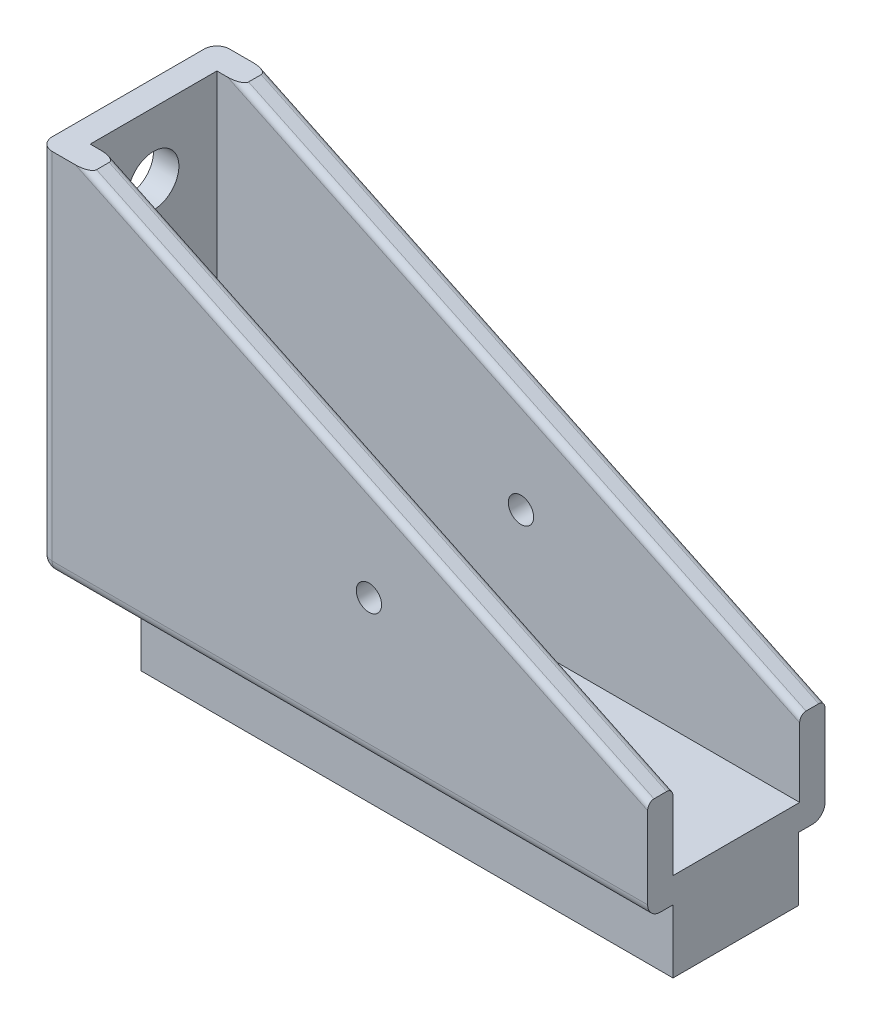
ISO-10303-21;
HEADER;
FILE_DESCRIPTION(('STEP AP214'),'2;1');
FILE_NAME('part.step','',(''),(''),'','','');
FILE_SCHEMA(('AUTOMOTIVE_DESIGN { 1 0 10303 214 1 1 1 1 }'));
ENDSEC;
DATA;
#1=APPLICATION_CONTEXT('core data for automotive mechanical design processes');
#2=APPLICATION_PROTOCOL_DEFINITION('international standard','automotive_design',2000,#1);
#3=PRODUCT_CONTEXT('',#1,'mechanical');
#4=PRODUCT('Part','Part','',(#3));
#5=PRODUCT_RELATED_PRODUCT_CATEGORY('part','',(#4));
#6=PRODUCT_DEFINITION_FORMATION('','',#4);
#7=PRODUCT_DEFINITION_CONTEXT('part definition',#1,'design');
#8=PRODUCT_DEFINITION('design','',#6,#7);
#9=PRODUCT_DEFINITION_SHAPE('','',#8);
#10=(LENGTH_UNIT() NAMED_UNIT(*) SI_UNIT(.MILLI.,.METRE.));
#11=(NAMED_UNIT(*) PLANE_ANGLE_UNIT() SI_UNIT($,.RADIAN.));
#12=(NAMED_UNIT(*) SI_UNIT($,.STERADIAN.) SOLID_ANGLE_UNIT());
#13=UNCERTAINTY_MEASURE_WITH_UNIT(LENGTH_MEASURE(1.E-05),#10,'distance_accuracy_value','');
#14=(GEOMETRIC_REPRESENTATION_CONTEXT(3) GLOBAL_UNCERTAINTY_ASSIGNED_CONTEXT((#13)) GLOBAL_UNIT_ASSIGNED_CONTEXT((#10,
#11,#12)) REPRESENTATION_CONTEXT('',''));
#15=CARTESIAN_POINT('',(0.,0.,0.));
#16=DIRECTION('',(0.,0.,1.));
#17=DIRECTION('',(1.,0.,0.));
#18=AXIS2_PLACEMENT_3D('',#15,#16,#17);
#19=CARTESIAN_POINT('',(-45.3827683615819,3.08601694915253,-14.));
#20=DIRECTION('',(0.,-1.,0.));
#21=DIRECTION('',(0.,0.,-1.));
#22=AXIS2_PLACEMENT_3D('',#19,#20,#21);
#23=PLANE('',#22);
#24=DIRECTION('',(1.,0.,0.));
#25=VECTOR('',#24,1.);
#26=CARTESIAN_POINT('',(-45.3827683615819,3.08601694915253,-1.));
#27=LINE('',#26,#25);
#28=CARTESIAN_POINT('',(2.61723163841807,3.08601694915253,-0.999999999999999));
#29=VERTEX_POINT('',#28);
#30=CARTESIAN_POINT('',(-44.3827683615819,3.08601694915253,-1.));
#31=VERTEX_POINT('',#30);
#32=EDGE_CURVE('E297',#29,#31,#27,.F.);
#33=ORIENTED_EDGE('',*,*,#32,.T.);
#34=DIRECTION('',(0.,0.,1.));
#35=VECTOR('',#34,1.);
#36=CARTESIAN_POINT('',(-44.3827683615819,3.08601694915253,-14.));
#37=LINE('',#36,#35);
#38=CARTESIAN_POINT('',(-44.3827683615819,3.08601694915253,-13.));
#39=VERTEX_POINT('',#38);
#40=EDGE_CURVE('E361',#31,#39,#37,.F.);
#41=ORIENTED_EDGE('',*,*,#40,.T.);
#42=DIRECTION('',(1.,0.,0.));
#43=VECTOR('',#42,1.);
#44=CARTESIAN_POINT('',(-45.3827683615819,3.08601694915253,-13.));
#45=LINE('',#44,#43);
#46=CARTESIAN_POINT('',(2.61723163841807,3.08601694915253,-13.));
#47=VERTEX_POINT('',#46);
#48=EDGE_CURVE('E299',#39,#47,#45,.T.);
#49=ORIENTED_EDGE('',*,*,#48,.T.);
#50=DIRECTION('',(0.,0.,1.));
#51=VECTOR('',#50,1.);
#52=CARTESIAN_POINT('',(2.61723163841807,3.08601694915253,-14.));
#53=LINE('',#52,#51);
#54=CARTESIAN_POINT('',(2.61723163841807,3.08601694915253,-11.9065683590887));
#55=VERTEX_POINT('',#54);
#56=EDGE_CURVE('E213',#47,#55,#53,.T.);
#57=ORIENTED_EDGE('',*,*,#56,.T.);
#58=DIRECTION('',(1.,0.,0.));
#59=VECTOR('',#58,1.);
#60=CARTESIAN_POINT('',(-39.3827683615819,3.08601694915253,-11.9065683590887));
#61=LINE('',#60,#59);
#62=CARTESIAN_POINT('',(-39.3827683615819,3.08601694915253,-11.9065683590887));
#63=VERTEX_POINT('',#62);
#64=EDGE_CURVE('E210',#63,#55,#61,.T.);
#65=ORIENTED_EDGE('',*,*,#64,.F.);
#66=DIRECTION('',(0.,0.,-1.));
#67=VECTOR('',#66,1.);
#68=CARTESIAN_POINT('',(-39.3827683615819,3.08601694915253,-12.));
#69=LINE('',#68,#67);
#70=CARTESIAN_POINT('',(-39.3827683615819,3.08601694915253,-12.));
#71=VERTEX_POINT('',#70);
#72=EDGE_CURVE('E195',#63,#71,#69,.T.);
#73=ORIENTED_EDGE('',*,*,#72,.T.);
#74=DIRECTION('',(-1.,0.,0.));
#75=VECTOR('',#74,1.);
#76=CARTESIAN_POINT('',(-43.3827683615819,3.08601694915253,-12.));
#77=LINE('',#76,#75);
#78=CARTESIAN_POINT('',(-43.3827683615819,3.08601694915253,-12.));
#79=VERTEX_POINT('',#78);
#80=EDGE_CURVE('E206',#71,#79,#77,.T.);
#81=ORIENTED_EDGE('',*,*,#80,.T.);
#82=DIRECTION('',(0.,0.,1.));
#83=VECTOR('',#82,1.);
#84=CARTESIAN_POINT('',(-43.3827683615819,3.08601694915253,-12.));
#85=LINE('',#84,#83);
#86=CARTESIAN_POINT('',(-43.3827683615819,3.08601694915253,-2.));
#87=VERTEX_POINT('',#86);
#88=EDGE_CURVE('E239',#79,#87,#85,.T.);
#89=ORIENTED_EDGE('',*,*,#88,.T.);
#90=DIRECTION('',(1.,0.,0.));
#91=VECTOR('',#90,1.);
#92=CARTESIAN_POINT('',(-43.3827683615819,3.08601694915253,-2.));
#93=LINE('',#92,#91);
#94=CARTESIAN_POINT('',(-39.3827683615819,3.08601694915253,-2.));
#95=VERTEX_POINT('',#94);
#96=EDGE_CURVE('E207',#87,#95,#93,.T.);
#97=ORIENTED_EDGE('',*,*,#96,.T.);
#98=DIRECTION('',(-1.,0.,0.));
#99=VECTOR('',#98,1.);
#100=CARTESIAN_POINT('',(-39.3827683615819,3.08601694915253,-2.));
#101=LINE('',#100,#99);
#102=CARTESIAN_POINT('',(2.61723163841807,3.08601694915253,-2.));
#103=VERTEX_POINT('',#102);
#104=EDGE_CURVE('E217',#103,#95,#101,.T.);
#105=ORIENTED_EDGE('',*,*,#104,.F.);
#106=EDGE_CURVE('E295',#103,#29,#53,.T.);
#107=ORIENTED_EDGE('',*,*,#106,.T.);
#108=EDGE_LOOP('',(#33,#41,#49,#57,#65,#73,#81,#89,#97,#105,#107));
#109=FACE_BOUND('',#108,.T.);
#110=ADVANCED_FACE('F36',(#109),#23,.T.);
#111=CARTESIAN_POINT('',(2.61723163841807,11.0860169491525,-14.));
#112=DIRECTION('',(0.430729586214938,0.90248103778368,0.));
#113=DIRECTION('',(-0.90248103778368,0.430729586214938,0.));
#114=AXIS2_PLACEMENT_3D('',#111,#112,#113);
#115=PLANE('',#114);
#116=DIRECTION('',(0.,0.,1.));
#117=VECTOR('',#116,1.);
#118=CARTESIAN_POINT('',(2.61723163841807,11.0860169491525,-14.));
#119=LINE('',#118,#117);
#120=CARTESIAN_POINT('',(2.61723163841807,11.0860169491525,-13.5));
#121=VERTEX_POINT('',#120);
#122=CARTESIAN_POINT('',(2.61723163841807,11.0860169491525,-12.5));
#123=VERTEX_POINT('',#122);
#124=EDGE_CURVE('E290',#121,#123,#119,.T.);
#125=ORIENTED_EDGE('',*,*,#124,.F.);
#126=DIRECTION('',(-0.90248103778368,0.430729586214938,0.));
#127=VECTOR('',#126,1.);
#128=CARTESIAN_POINT('',(2.61723163841807,11.0860169491525,-13.5));
#129=LINE('',#128,#127);
#130=CARTESIAN_POINT('',(-41.3827683615819,32.0860169491525,-13.5));
#131=VERTEX_POINT('',#130);
#132=EDGE_CURVE('E312',#121,#131,#129,.T.);
#133=ORIENTED_EDGE('',*,*,#132,.T.);
#134=DIRECTION('',(0.,0.,1.));
#135=VECTOR('',#134,1.);
#136=CARTESIAN_POINT('',(-41.3827683615819,32.0860169491525,-14.));
#137=LINE('',#136,#135);
#138=CARTESIAN_POINT('',(-41.3827683615819,32.0860169491525,-12.5));
#139=VERTEX_POINT('',#138);
#140=EDGE_CURVE('E289',#131,#139,#137,.T.);
#141=ORIENTED_EDGE('',*,*,#140,.T.);
#142=DIRECTION('',(-0.90248103778368,0.430729586214938,0.));
#143=VECTOR('',#142,1.);
#144=CARTESIAN_POINT('',(2.61723163841807,11.0860169491525,-12.5));
#145=LINE('',#144,#143);
#146=EDGE_CURVE('E310',#139,#123,#145,.F.);
#147=ORIENTED_EDGE('',*,*,#146,.T.);
#148=EDGE_LOOP('',(#125,#133,#141,#147));
#149=FACE_BOUND('',#148,.T.);
#150=ADVANCED_FACE('F455',(#149),#115,.T.);
#151=CARTESIAN_POINT('',(-41.3827683615819,32.0860169491525,-14.));
#152=DIRECTION('',(0.,1.,0.));
#153=DIRECTION('',(0.,0.,1.));
#154=AXIS2_PLACEMENT_3D('',#151,#152,#153);
#155=PLANE('',#154);
#156=DIRECTION('',(0.,0.,1.));
#157=VECTOR('',#156,1.);
#158=CARTESIAN_POINT('',(-45.3827683615819,32.0860169491525,-14.));
#159=LINE('',#158,#157);
#160=CARTESIAN_POINT('',(-45.3827683615819,32.0860169491525,-13.));
#161=VERTEX_POINT('',#160);
#162=CARTESIAN_POINT('',(-45.3827683615819,32.0860169491525,-0.999999999999999));
#163=VERTEX_POINT('',#162);
#164=EDGE_CURVE('E285',#161,#163,#159,.T.);
#165=ORIENTED_EDGE('',*,*,#164,.T.);
#166=CARTESIAN_POINT('',(-44.3827683615819,32.0860169491525,-1.));
#167=DIRECTION('',(0.,1.,0.));
#168=DIRECTION('',(0.,0.,1.));
#169=AXIS2_PLACEMENT_3D('',#166,#167,#168);
#170=CIRCLE('',#169,1.);
#171=CARTESIAN_POINT('',(-44.3827683615819,32.0860169491525,0.));
#172=VERTEX_POINT('',#171);
#173=EDGE_CURVE('E44',#163,#172,#170,.T.);
#174=ORIENTED_EDGE('',*,*,#173,.T.);
#175=DIRECTION('',(-1.,0.,0.));
#176=VECTOR('',#175,1.);
#177=CARTESIAN_POINT('',(-41.3827683615819,32.0860169491525,0.));
#178=LINE('',#177,#176);
#179=CARTESIAN_POINT('',(-42.5435894799866,32.0860169491525,0.));
#180=VERTEX_POINT('',#179);
#181=EDGE_CURVE('E268',#180,#172,#178,.T.);
#182=ORIENTED_EDGE('',*,*,#181,.F.);
#183=CARTESIAN_POINT('',(-42.5435894799866,32.0860169491525,-0.5));
#184=DIRECTION('',(0.,1.,0.));
#185=DIRECTION('',(1.,0.,0.));
#186=AXIS2_PLACEMENT_3D('',#183,#184,#185);
#187=ELLIPSE('',#186,1.16082111840466,0.5);
#188=CARTESIAN_POINT('',(-41.3827683615819,32.0860169491525,-0.5));
#189=VERTEX_POINT('',#188);
#190=EDGE_CURVE('E315',#180,#189,#187,.T.);
#191=ORIENTED_EDGE('',*,*,#190,.T.);
#192=CARTESIAN_POINT('',(-41.3827683615819,32.0860169491525,-1.5));
#193=VERTEX_POINT('',#192);
#194=EDGE_CURVE('E286',#193,#189,#137,.T.);
#195=ORIENTED_EDGE('',*,*,#194,.F.);
#196=CARTESIAN_POINT('',(-42.5435894799866,32.0860169491525,-1.5));
#197=DIRECTION('',(0.,1.,0.));
#198=DIRECTION('',(-1.,0.,0.));
#199=AXIS2_PLACEMENT_3D('',#196,#197,#198);
#200=ELLIPSE('',#199,1.16082111840466,0.5);
#201=CARTESIAN_POINT('',(-42.5435894799866,32.0860169491525,-2.));
#202=VERTEX_POINT('',#201);
#203=EDGE_CURVE('E317',#193,#202,#200,.T.);
#204=ORIENTED_EDGE('',*,*,#203,.T.);
#205=DIRECTION('',(1.,0.,0.));
#206=VECTOR('',#205,1.);
#207=CARTESIAN_POINT('',(-43.3827683615819,32.0860169491525,-2.));
#208=LINE('',#207,#206);
#209=CARTESIAN_POINT('',(-43.3827683615819,32.0860169491525,-2.));
#210=VERTEX_POINT('',#209);
#211=EDGE_CURVE('E253',#210,#202,#208,.T.);
#212=ORIENTED_EDGE('',*,*,#211,.F.);
#213=DIRECTION('',(0.,0.,1.));
#214=VECTOR('',#213,1.);
#215=CARTESIAN_POINT('',(-43.3827683615819,32.0860169491525,-2.));
#216=LINE('',#215,#214);
#217=CARTESIAN_POINT('',(-43.3827683615819,32.0860169491525,-12.));
#218=VERTEX_POINT('',#217);
#219=EDGE_CURVE('E250',#218,#210,#216,.T.);
#220=ORIENTED_EDGE('',*,*,#219,.F.);
#221=DIRECTION('',(-1.,0.,0.));
#222=VECTOR('',#221,1.);
#223=CARTESIAN_POINT('',(-43.3827683615819,32.0860169491525,-12.));
#224=LINE('',#223,#222);
#225=CARTESIAN_POINT('',(-42.5435894799866,32.0860169491525,-12.));
#226=VERTEX_POINT('',#225);
#227=EDGE_CURVE('E247',#226,#218,#224,.T.);
#228=ORIENTED_EDGE('',*,*,#227,.F.);
#229=CARTESIAN_POINT('',(-42.5435894799866,32.0860169491525,-12.5));
#230=DIRECTION('',(0.,1.,0.));
#231=DIRECTION('',(1.,0.,0.));
#232=AXIS2_PLACEMENT_3D('',#229,#230,#231);
#233=ELLIPSE('',#232,1.16082111840466,0.5);
#234=EDGE_CURVE('E319',#226,#139,#233,.T.);
#235=ORIENTED_EDGE('',*,*,#234,.T.);
#236=ORIENTED_EDGE('',*,*,#140,.F.);
#237=CARTESIAN_POINT('',(-42.5435894799866,32.0860169491525,-13.5));
#238=DIRECTION('',(0.,1.,0.));
#239=DIRECTION('',(-1.,0.,0.));
#240=AXIS2_PLACEMENT_3D('',#237,#238,#239);
#241=ELLIPSE('',#240,1.16082111840466,0.5);
#242=CARTESIAN_POINT('',(-42.5435894799866,32.0860169491525,-14.));
#243=VERTEX_POINT('',#242);
#244=EDGE_CURVE('E321',#131,#243,#241,.T.);
#245=ORIENTED_EDGE('',*,*,#244,.T.);
#246=DIRECTION('',(-1.,0.,0.));
#247=VECTOR('',#246,1.);
#248=CARTESIAN_POINT('',(-41.3827683615819,32.0860169491525,-14.));
#249=LINE('',#248,#247);
#250=CARTESIAN_POINT('',(-44.3827683615819,32.0860169491525,-14.));
#251=VERTEX_POINT('',#250);
#252=EDGE_CURVE('E280',#243,#251,#249,.T.);
#253=ORIENTED_EDGE('',*,*,#252,.T.);
#254=CARTESIAN_POINT('',(-44.3827683615819,32.0860169491525,-13.));
#255=DIRECTION('',(0.,1.,0.));
#256=DIRECTION('',(0.,0.,1.));
#257=AXIS2_PLACEMENT_3D('',#254,#255,#256);
#258=CIRCLE('',#257,1.);
#259=EDGE_CURVE('E369',#251,#161,#258,.T.);
#260=ORIENTED_EDGE('',*,*,#259,.T.);
#261=EDGE_LOOP('',(#165,#174,#182,#191,#195,#204,#212,#220,#228,#235,#236,#245,#253,#260));
#262=FACE_BOUND('',#261,.T.);
#263=ADVANCED_FACE('F38',(#262),#155,.T.);
#264=CARTESIAN_POINT('',(2.61723163841807,11.0860169491525,-1.5));
#265=VERTEX_POINT('',#264);
#266=CARTESIAN_POINT('',(2.61723163841807,11.0860169491525,-0.5));
#267=VERTEX_POINT('',#266);
#268=EDGE_CURVE('E291',#265,#267,#119,.T.);
#269=ORIENTED_EDGE('',*,*,#268,.F.);
#270=DIRECTION('',(0.90248103778368,-0.430729586214938,0.));
#271=VECTOR('',#270,1.);
#272=CARTESIAN_POINT('',(-41.3827683615819,32.0860169491525,-1.5));
#273=LINE('',#272,#271);
#274=EDGE_CURVE('E341',#265,#193,#273,.F.);
#275=ORIENTED_EDGE('',*,*,#274,.T.);
#276=ORIENTED_EDGE('',*,*,#194,.T.);
#277=DIRECTION('',(-0.90248103778368,0.430729586214938,0.));
#278=VECTOR('',#277,1.);
#279=CARTESIAN_POINT('',(2.61723163841807,11.0860169491525,-0.5));
#280=LINE('',#279,#278);
#281=EDGE_CURVE('E339',#189,#267,#280,.F.);
#282=ORIENTED_EDGE('',*,*,#281,.T.);
#283=EDGE_LOOP('',(#269,#275,#276,#282));
#284=FACE_BOUND('',#283,.T.);
#285=ADVANCED_FACE('F427',(#284),#115,.T.);
#286=CARTESIAN_POINT('',(2.61723163841807,3.08601694915253,-14.));
#287=DIRECTION('',(1.,0.,0.));
#288=DIRECTION('',(0.,0.,-1.));
#289=AXIS2_PLACEMENT_3D('',#286,#287,#288);
#290=PLANE('',#289);
#291=DIRECTION('',(0.,1.,0.));
#292=VECTOR('',#291,1.);
#293=CARTESIAN_POINT('',(2.61723163841807,3.08601694915253,-14.));
#294=LINE('',#293,#292);
#295=CARTESIAN_POINT('',(2.61723163841807,4.08601694915254,-14.));
#296=VERTEX_POINT('',#295);
#297=CARTESIAN_POINT('',(2.61723163841807,10.5319886880958,-14.));
#298=VERTEX_POINT('',#297);
#299=EDGE_CURVE('E282',#296,#298,#294,.T.);
#300=ORIENTED_EDGE('',*,*,#299,.T.);
#301=CARTESIAN_POINT('',(2.61723163841807,10.5319886880958,-13.5));
#302=DIRECTION('',(1.,0.,0.));
#303=DIRECTION('',(0.,1.,0.));
#304=AXIS2_PLACEMENT_3D('',#301,#302,#303);
#305=ELLIPSE('',#304,0.554028261056769,0.5);
#306=EDGE_CURVE('E331',#298,#121,#305,.T.);
#307=ORIENTED_EDGE('',*,*,#306,.T.);
#308=ORIENTED_EDGE('',*,*,#124,.T.);
#309=CARTESIAN_POINT('',(2.61723163841807,10.5319886880958,-12.5));
#310=DIRECTION('',(1.,0.,0.));
#311=DIRECTION('',(0.,-1.,0.));
#312=AXIS2_PLACEMENT_3D('',#309,#310,#311);
#313=ELLIPSE('',#312,0.554028261056769,0.5);
#314=CARTESIAN_POINT('',(2.61723163841807,10.5319886880958,-12.));
#315=VERTEX_POINT('',#314);
#316=EDGE_CURVE('E329',#123,#315,#313,.T.);
#317=ORIENTED_EDGE('',*,*,#316,.T.);
#318=DIRECTION('',(0.,1.,0.));
#319=VECTOR('',#318,1.);
#320=CARTESIAN_POINT('',(2.61723163841807,5.08601694915254,-12.));
#321=LINE('',#320,#319);
#322=CARTESIAN_POINT('',(2.61723163841807,5.08601694915254,-12.));
#323=VERTEX_POINT('',#322);
#324=EDGE_CURVE('E265',#323,#315,#321,.T.);
#325=ORIENTED_EDGE('',*,*,#324,.F.);
#326=DIRECTION('',(0.,0.,-1.));
#327=VECTOR('',#326,1.);
#328=CARTESIAN_POINT('',(2.61723163841807,5.08601694915254,-2.00000000000001));
#329=LINE('',#328,#327);
#330=CARTESIAN_POINT('',(2.61723163841807,5.08601694915254,-2.));
#331=VERTEX_POINT('',#330);
#332=EDGE_CURVE('E261',#331,#323,#329,.T.);
#333=ORIENTED_EDGE('',*,*,#332,.F.);
#334=DIRECTION('',(0.,1.,0.));
#335=VECTOR('',#334,1.);
#336=CARTESIAN_POINT('',(2.61723163841807,5.08601694915254,-2.00000000000001));
#337=LINE('',#336,#335);
#338=CARTESIAN_POINT('',(2.61723163841807,10.5319886880958,-2.00000000000001));
#339=VERTEX_POINT('',#338);
#340=EDGE_CURVE('E269',#331,#339,#337,.T.);
#341=ORIENTED_EDGE('',*,*,#340,.T.);
#342=CARTESIAN_POINT('',(2.61723163841807,10.5319886880958,-1.50000000000001));
#343=DIRECTION('',(1.,0.,0.));
#344=DIRECTION('',(0.,1.,0.));
#345=AXIS2_PLACEMENT_3D('',#342,#343,#344);
#346=ELLIPSE('',#345,0.554028261056769,0.5);
#347=EDGE_CURVE('E327',#339,#265,#346,.T.);
#348=ORIENTED_EDGE('',*,*,#347,.T.);
#349=ORIENTED_EDGE('',*,*,#268,.T.);
#350=CARTESIAN_POINT('',(2.61723163841807,10.5319886880958,-0.5));
#351=DIRECTION('',(1.,0.,0.));
#352=DIRECTION('',(0.,-1.,0.));
#353=AXIS2_PLACEMENT_3D('',#350,#351,#352);
#354=ELLIPSE('',#353,0.554028261056769,0.5);
#355=CARTESIAN_POINT('',(2.61723163841807,10.5319886880958,0.));
#356=VERTEX_POINT('',#355);
#357=EDGE_CURVE('E325',#267,#356,#354,.T.);
#358=ORIENTED_EDGE('',*,*,#357,.T.);
#359=DIRECTION('',(0.,1.,0.));
#360=VECTOR('',#359,1.);
#361=CARTESIAN_POINT('',(2.61723163841807,3.08601694915253,0.));
#362=LINE('',#361,#360);
#363=CARTESIAN_POINT('',(2.61723163841807,4.08601694915254,0.));
#364=VERTEX_POINT('',#363);
#365=EDGE_CURVE('E277',#364,#356,#362,.T.);
#366=ORIENTED_EDGE('',*,*,#365,.F.);
#367=CARTESIAN_POINT('',(2.61723163841807,4.08601694915254,-1.));
#368=DIRECTION('',(1.,0.,0.));
#369=DIRECTION('',(0.,0.,-1.));
#370=AXIS2_PLACEMENT_3D('',#367,#368,#369);
#371=CIRCLE('',#370,1.);
#372=EDGE_CURVE('E301',#364,#29,#371,.T.);
#373=ORIENTED_EDGE('',*,*,#372,.T.);
#374=ORIENTED_EDGE('',*,*,#106,.F.);
#375=DIRECTION('',(0.,1.,0.));
#376=VECTOR('',#375,1.);
#377=CARTESIAN_POINT('',(2.61723163841807,-1.91398305084747,-2.));
#378=LINE('',#377,#376);
#379=CARTESIAN_POINT('',(2.61723163841807,-1.91398305084747,-2.));
#380=VERTEX_POINT('',#379);
#381=EDGE_CURVE('E229',#380,#103,#378,.T.);
#382=ORIENTED_EDGE('',*,*,#381,.F.);
#383=DIRECTION('',(0.,0.,1.));
#384=VECTOR('',#383,1.);
#385=CARTESIAN_POINT('',(2.61723163841807,-1.91398305084747,-2.));
#386=LINE('',#385,#384);
#387=CARTESIAN_POINT('',(2.61723163841807,-1.91398305084747,-11.9065683590887));
#388=VERTEX_POINT('',#387);
#389=EDGE_CURVE('E482',#388,#380,#386,.T.);
#390=ORIENTED_EDGE('',*,*,#389,.F.);
#391=DIRECTION('',(0.,1.,0.));
#392=VECTOR('',#391,1.);
#393=CARTESIAN_POINT('',(2.61723163841807,-1.91398305084747,-11.9065683590887));
#394=LINE('',#393,#392);
#395=EDGE_CURVE('E224',#388,#55,#394,.T.);
#396=ORIENTED_EDGE('',*,*,#395,.T.);
#397=ORIENTED_EDGE('',*,*,#56,.F.);
#398=CARTESIAN_POINT('',(2.61723163841807,4.08601694915254,-13.));
#399=DIRECTION('',(1.,0.,0.));
#400=DIRECTION('',(0.,0.,-1.));
#401=AXIS2_PLACEMENT_3D('',#398,#399,#400);
#402=CIRCLE('',#401,1.);
#403=EDGE_CURVE('E304',#47,#296,#402,.T.);
#404=ORIENTED_EDGE('',*,*,#403,.T.);
#405=EDGE_LOOP('',(#300,#307,#308,#317,#325,#333,#341,#348,#349,#358,#366,#373,#374,#382,#390,
#396,#397,#404));
#406=FACE_BOUND('',#405,.T.);
#407=ADVANCED_FACE('F417',(#406),#290,.T.);
#408=CARTESIAN_POINT('',(-45.3827683615819,32.0860169491525,-14.));
#409=DIRECTION('',(-1.,0.,0.));
#410=DIRECTION('',(0.,-1.,0.));
#411=AXIS2_PLACEMENT_3D('',#408,#409,#410);
#412=PLANE('',#411);
#413=CARTESIAN_POINT('',(-45.3827683615819,20.0860169491525,-7.));
#414=DIRECTION('',(-1.,0.,0.));
#415=DIRECTION('',(0.,-1.,0.));
#416=AXIS2_PLACEMENT_3D('',#413,#414,#415);
#417=CIRCLE('',#416,2.);
#418=CARTESIAN_POINT('',(-45.3827683615819,18.0860169491525,-7.));
#419=VERTEX_POINT('',#418);
#420=EDGE_CURVE('E223',#419,#419,#417,.T.);
#421=ORIENTED_EDGE('',*,*,#420,.F.);
#422=EDGE_LOOP('',(#421));
#423=FACE_BOUND('',#422,.T.);
#424=CARTESIAN_POINT('',(-45.3827683615819,27.0860169491525,-7.));
#425=DIRECTION('',(-1.,0.,0.));
#426=DIRECTION('',(0.,-1.,0.));
#427=AXIS2_PLACEMENT_3D('',#424,#425,#426);
#428=CIRCLE('',#427,2.);
#429=CARTESIAN_POINT('',(-45.3827683615819,25.0860169491525,-7.));
#430=VERTEX_POINT('',#429);
#431=EDGE_CURVE('E233',#430,#430,#428,.T.);
#432=ORIENTED_EDGE('',*,*,#431,.F.);
#433=EDGE_LOOP('',(#432));
#434=FACE_BOUND('',#433,.T.);
#435=DIRECTION('',(0.,0.,1.));
#436=VECTOR('',#435,1.);
#437=CARTESIAN_POINT('',(-45.3827683615819,4.08601694915254,-14.));
#438=LINE('',#437,#436);
#439=CARTESIAN_POINT('',(-45.3827683615819,4.08601694915253,-13.));
#440=VERTEX_POINT('',#439);
#441=CARTESIAN_POINT('',(-45.3827683615819,4.08601694915254,-1.));
#442=VERTEX_POINT('',#441);
#443=EDGE_CURVE('E356',#440,#442,#438,.T.);
#444=ORIENTED_EDGE('',*,*,#443,.T.);
#445=DIRECTION('',(0.,-1.,0.));
#446=VECTOR('',#445,1.);
#447=CARTESIAN_POINT('',(-45.3827683615819,32.0860169491525,-1.));
#448=LINE('',#447,#446);
#449=EDGE_CURVE('E359',#442,#163,#448,.F.);
#450=ORIENTED_EDGE('',*,*,#449,.T.);
#451=ORIENTED_EDGE('',*,*,#164,.F.);
#452=DIRECTION('',(0.,-1.,0.));
#453=VECTOR('',#452,1.);
#454=CARTESIAN_POINT('',(-45.3827683615819,32.0860169491525,-13.));
#455=LINE('',#454,#453);
#456=EDGE_CURVE('E346',#161,#440,#455,.T.);
#457=ORIENTED_EDGE('',*,*,#456,.T.);
#458=EDGE_LOOP('',(#444,#450,#451,#457));
#459=FACE_BOUND('',#458,.T.);
#460=ADVANCED_FACE('F375',(#423,#434,#459),#412,.T.);
#461=CARTESIAN_POINT('',(2.61723163841807,32.0860169491525,-14.));
#462=DIRECTION('',(0.,0.,-1.));
#463=DIRECTION('',(-1.,0.,0.));
#464=AXIS2_PLACEMENT_3D('',#461,#462,#463);
#465=PLANE('',#464);
#466=CARTESIAN_POINT('',(-19.3827683615819,14.0860169491525,-14.));
#467=DIRECTION('',(0.,0.,1.));
#468=DIRECTION('',(1.,0.,0.));
#469=AXIS2_PLACEMENT_3D('',#466,#467,#468);
#470=CIRCLE('',#469,1.);
#471=CARTESIAN_POINT('',(-18.3827683615819,14.0860169491525,-14.));
#472=VERTEX_POINT('',#471);
#473=EDGE_CURVE('E354',#472,#472,#470,.T.);
#474=ORIENTED_EDGE('',*,*,#473,.T.);
#475=EDGE_LOOP('',(#474));
#476=FACE_BOUND('',#475,.T.);
#477=DIRECTION('',(1.,0.,0.));
#478=VECTOR('',#477,1.);
#479=CARTESIAN_POINT('',(2.61723163841807,4.08601694915254,-14.));
#480=LINE('',#479,#478);
#481=CARTESIAN_POINT('',(-44.3827683615819,4.08601694915254,-14.));
#482=VERTEX_POINT('',#481);
#483=EDGE_CURVE('E306',#296,#482,#480,.F.);
#484=ORIENTED_EDGE('',*,*,#483,.T.);
#485=DIRECTION('',(0.,-1.,0.));
#486=VECTOR('',#485,1.);
#487=CARTESIAN_POINT('',(-44.3827683615819,32.0860169491525,-14.));
#488=LINE('',#487,#486);
#489=EDGE_CURVE('E12',#482,#251,#488,.F.);
#490=ORIENTED_EDGE('',*,*,#489,.T.);
#491=ORIENTED_EDGE('',*,*,#252,.F.);
#492=DIRECTION('',(-0.90248103778368,0.430729586214938,0.));
#493=VECTOR('',#492,1.);
#494=CARTESIAN_POINT('',(-5.76136411808864,14.5308639355194,-14.));
#495=LINE('',#494,#493);
#496=EDGE_CURVE('E323',#243,#298,#495,.F.);
#497=ORIENTED_EDGE('',*,*,#496,.T.);
#498=ORIENTED_EDGE('',*,*,#299,.F.);
#499=EDGE_LOOP('',(#484,#490,#491,#497,#498));
#500=FACE_BOUND('',#499,.T.);
#501=ADVANCED_FACE('F462',(#476,#500),#465,.T.);
#502=CARTESIAN_POINT('',(2.61723163841807,32.0860169491525,0.));
#503=DIRECTION('',(0.,0.,-1.));
#504=DIRECTION('',(-1.,0.,0.));
#505=AXIS2_PLACEMENT_3D('',#502,#503,#504);
#506=PLANE('',#505);
#507=CARTESIAN_POINT('',(-19.3827683615819,14.0860169491525,0.));
#508=DIRECTION('',(0.,0.,1.));
#509=DIRECTION('',(1.,0.,0.));
#510=AXIS2_PLACEMENT_3D('',#507,#508,#509);
#511=CIRCLE('',#510,1.);
#512=CARTESIAN_POINT('',(-18.3827683615819,14.0860169491525,0.));
#513=VERTEX_POINT('',#512);
#514=EDGE_CURVE('E384',#513,#513,#511,.T.);
#515=ORIENTED_EDGE('',*,*,#514,.F.);
#516=EDGE_LOOP('',(#515));
#517=FACE_BOUND('',#516,.T.);
#518=ORIENTED_EDGE('',*,*,#181,.T.);
#519=DIRECTION('',(0.,-1.,0.));
#520=VECTOR('',#519,1.);
#521=CARTESIAN_POINT('',(-44.3827683615819,4.08601694915254,0.));
#522=LINE('',#521,#520);
#523=CARTESIAN_POINT('',(-44.3827683615819,4.08601694915254,0.));
#524=VERTEX_POINT('',#523);
#525=EDGE_CURVE('E367',#172,#524,#522,.T.);
#526=ORIENTED_EDGE('',*,*,#525,.T.);
#527=DIRECTION('',(1.,0.,0.));
#528=VECTOR('',#527,1.);
#529=CARTESIAN_POINT('',(2.61723163841807,4.08601694915254,0.));
#530=LINE('',#529,#528);
#531=EDGE_CURVE('E308',#524,#364,#530,.T.);
#532=ORIENTED_EDGE('',*,*,#531,.T.);
#533=ORIENTED_EDGE('',*,*,#365,.T.);
#534=DIRECTION('',(-0.90248103778368,0.430729586214938,0.));
#535=VECTOR('',#534,1.);
#536=CARTESIAN_POINT('',(-41.5981331546894,31.6347764302607,0.));
#537=LINE('',#536,#535);
#538=EDGE_CURVE('E343',#356,#180,#537,.T.);
#539=ORIENTED_EDGE('',*,*,#538,.T.);
#540=EDGE_LOOP('',(#518,#526,#532,#533,#539));
#541=FACE_BOUND('',#540,.T.);
#542=ADVANCED_FACE('F409',(#517,#541),#506,.F.);
#543=CARTESIAN_POINT('',(-45.3827683615819,4.08601694915254,-13.));
#544=DIRECTION('',(1.,0.,0.));
#545=DIRECTION('',(0.,0.,-1.));
#546=AXIS2_PLACEMENT_3D('',#543,#544,#545);
#547=CYLINDRICAL_SURFACE('',#546,1.);
#548=ORIENTED_EDGE('',*,*,#48,.F.);
#549=CARTESIAN_POINT('',(-44.3827683615819,4.08601694915254,-13.));
#550=DIRECTION('',(1.,0.,0.));
#551=DIRECTION('',(0.,0.,-1.));
#552=AXIS2_PLACEMENT_3D('',#549,#550,#551);
#553=CIRCLE('',#552,1.);
#554=EDGE_CURVE('E365',#39,#482,#553,.T.);
#555=ORIENTED_EDGE('',*,*,#554,.T.);
#556=ORIENTED_EDGE('',*,*,#483,.F.);
#557=ORIENTED_EDGE('',*,*,#403,.F.);
#558=EDGE_LOOP('',(#548,#555,#556,#557));
#559=FACE_BOUND('',#558,.T.);
#560=ADVANCED_FACE('F467',(#559),#547,.T.);
#561=CARTESIAN_POINT('',(2.61723163841807,4.08601694915254,-1.));
#562=DIRECTION('',(-1.,0.,0.));
#563=DIRECTION('',(0.,0.,1.));
#564=AXIS2_PLACEMENT_3D('',#561,#562,#563);
#565=CYLINDRICAL_SURFACE('',#564,1.);
#566=ORIENTED_EDGE('',*,*,#531,.F.);
#567=CARTESIAN_POINT('',(-44.3827683615819,4.08601694915254,-1.));
#568=DIRECTION('',(-1.,0.,0.));
#569=DIRECTION('',(0.,0.,1.));
#570=AXIS2_PLACEMENT_3D('',#567,#568,#569);
#571=CIRCLE('',#570,1.);
#572=EDGE_CURVE('E363',#524,#31,#571,.F.);
#573=ORIENTED_EDGE('',*,*,#572,.T.);
#574=ORIENTED_EDGE('',*,*,#32,.F.);
#575=ORIENTED_EDGE('',*,*,#372,.F.);
#576=EDGE_LOOP('',(#566,#573,#574,#575));
#577=FACE_BOUND('',#576,.T.);
#578=ADVANCED_FACE('F412',(#577),#565,.T.);
#579=CARTESIAN_POINT('',(-43.3827683615819,5.08601694915254,-12.));
#580=DIRECTION('',(0.,0.,-1.));
#581=DIRECTION('',(-1.,0.,0.));
#582=AXIS2_PLACEMENT_3D('',#579,#580,#581);
#583=PLANE('',#582);
#584=CARTESIAN_POINT('',(-19.3827683615819,14.0860169491525,-12.));
#585=DIRECTION('',(0.,0.,-1.));
#586=DIRECTION('',(-1.,0.,0.));
#587=AXIS2_PLACEMENT_3D('',#584,#585,#586);
#588=CIRCLE('',#587,1.);
#589=CARTESIAN_POINT('',(-20.3827683615819,14.0860169491525,-12.));
#590=VERTEX_POINT('',#589);
#591=EDGE_CURVE('E218',#590,#590,#588,.T.);
#592=ORIENTED_EDGE('',*,*,#591,.T.);
#593=EDGE_LOOP('',(#592));
#594=FACE_BOUND('',#593,.T.);
#595=ORIENTED_EDGE('',*,*,#324,.T.);
#596=DIRECTION('',(-0.90248103778368,0.430729586214938,0.));
#597=VECTOR('',#596,1.);
#598=CARTESIAN_POINT('',(-41.5981331546894,31.6347764302607,-12.));
#599=LINE('',#598,#597);
#600=EDGE_CURVE('E333',#315,#226,#599,.T.);
#601=ORIENTED_EDGE('',*,*,#600,.T.);
#602=ORIENTED_EDGE('',*,*,#227,.T.);
#603=DIRECTION('',(0.,1.,0.));
#604=VECTOR('',#603,1.);
#605=CARTESIAN_POINT('',(-43.3827683615819,5.08601694915254,-12.));
#606=LINE('',#605,#604);
#607=EDGE_CURVE('E264',#79,#218,#606,.T.);
#608=ORIENTED_EDGE('',*,*,#607,.F.);
#609=ORIENTED_EDGE('',*,*,#80,.F.);
#610=DIRECTION('',(0.,1.,0.));
#611=VECTOR('',#610,1.);
#612=CARTESIAN_POINT('',(-39.3827683615819,3.08601694915253,-12.));
#613=LINE('',#612,#611);
#614=CARTESIAN_POINT('',(-39.3827683615819,5.08601694915254,-12.));
#615=VERTEX_POINT('',#614);
#616=EDGE_CURVE('E202',#71,#615,#613,.T.);
#617=ORIENTED_EDGE('',*,*,#616,.T.);
#618=DIRECTION('',(-1.,0.,0.));
#619=VECTOR('',#618,1.);
#620=CARTESIAN_POINT('',(-43.3827683615819,5.08601694915254,-12.));
#621=LINE('',#620,#619);
#622=EDGE_CURVE('E256',#323,#615,#621,.T.);
#623=ORIENTED_EDGE('',*,*,#622,.F.);
#624=EDGE_LOOP('',(#595,#601,#602,#608,#609,#617,#623));
#625=FACE_BOUND('',#624,.T.);
#626=ADVANCED_FACE('F445',(#594,#625),#583,.F.);
#627=CARTESIAN_POINT('',(-43.3827683615819,5.08601694915254,-2.));
#628=DIRECTION('',(0.,0.,1.));
#629=DIRECTION('',(1.,0.,0.));
#630=AXIS2_PLACEMENT_3D('',#627,#628,#629);
#631=PLANE('',#630);
#632=CARTESIAN_POINT('',(-19.3827683615819,14.0860169491525,-2.));
#633=DIRECTION('',(0.,0.,1.));
#634=DIRECTION('',(1.,0.,0.));
#635=AXIS2_PLACEMENT_3D('',#632,#633,#634);
#636=CIRCLE('',#635,1.);
#637=CARTESIAN_POINT('',(-18.3827683615819,14.0860169491525,-2.));
#638=VERTEX_POINT('',#637);
#639=EDGE_CURVE('E351',#638,#638,#636,.T.);
#640=ORIENTED_EDGE('',*,*,#639,.T.);
#641=EDGE_LOOP('',(#640));
#642=FACE_BOUND('',#641,.T.);
#643=ORIENTED_EDGE('',*,*,#211,.T.);
#644=DIRECTION('',(0.90248103778368,-0.430729586214938,0.));
#645=VECTOR('',#644,1.);
#646=CARTESIAN_POINT('',(2.4018668453106,10.6347764302607,-2.00000000000001));
#647=LINE('',#646,#645);
#648=EDGE_CURVE('E336',#202,#339,#647,.T.);
#649=ORIENTED_EDGE('',*,*,#648,.T.);
#650=ORIENTED_EDGE('',*,*,#340,.F.);
#651=DIRECTION('',(1.,0.,0.));
#652=VECTOR('',#651,1.);
#653=CARTESIAN_POINT('',(-43.3827683615819,5.08601694915254,-2.));
#654=LINE('',#653,#652);
#655=CARTESIAN_POINT('',(-39.3827683615819,5.08601694915254,-2.));
#656=VERTEX_POINT('',#655);
#657=EDGE_CURVE('E259',#656,#331,#654,.T.);
#658=ORIENTED_EDGE('',*,*,#657,.F.);
#659=DIRECTION('',(0.,1.,0.));
#660=VECTOR('',#659,1.);
#661=CARTESIAN_POINT('',(-39.3827683615819,3.08601694915253,-2.));
#662=LINE('',#661,#660);
#663=EDGE_CURVE('E245',#95,#656,#662,.T.);
#664=ORIENTED_EDGE('',*,*,#663,.F.);
#665=ORIENTED_EDGE('',*,*,#96,.F.);
#666=DIRECTION('',(0.,1.,0.));
#667=VECTOR('',#666,1.);
#668=CARTESIAN_POINT('',(-43.3827683615819,5.08601694915254,-2.));
#669=LINE('',#668,#667);
#670=EDGE_CURVE('E272',#87,#210,#669,.T.);
#671=ORIENTED_EDGE('',*,*,#670,.T.);
#672=EDGE_LOOP('',(#643,#649,#650,#658,#664,#665,#671));
#673=FACE_BOUND('',#672,.T.);
#674=ADVANCED_FACE('F435',(#642,#673),#631,.F.);
#675=CARTESIAN_POINT('',(-43.3827683615819,5.08601694915254,-2.));
#676=DIRECTION('',(-1.,0.,0.));
#677=DIRECTION('',(0.,0.,1.));
#678=AXIS2_PLACEMENT_3D('',#675,#676,#677);
#679=PLANE('',#678);
#680=CARTESIAN_POINT('',(-43.3827683615819,20.0860169491525,-7.));
#681=DIRECTION('',(-1.,0.,0.));
#682=DIRECTION('',(0.,0.,1.));
#683=AXIS2_PLACEMENT_3D('',#680,#681,#682);
#684=CIRCLE('',#683,2.);
#685=CARTESIAN_POINT('',(-43.3827683615819,20.0860169491525,-5.));
#686=VERTEX_POINT('',#685);
#687=EDGE_CURVE('E227',#686,#686,#684,.T.);
#688=ORIENTED_EDGE('',*,*,#687,.T.);
#689=EDGE_LOOP('',(#688));
#690=FACE_BOUND('',#689,.T.);
#691=CARTESIAN_POINT('',(-43.3827683615819,27.0860169491525,-7.));
#692=DIRECTION('',(-1.,0.,0.));
#693=DIRECTION('',(0.,0.,1.));
#694=AXIS2_PLACEMENT_3D('',#691,#692,#693);
#695=CIRCLE('',#694,2.);
#696=CARTESIAN_POINT('',(-43.3827683615819,27.0860169491525,-5.));
#697=VERTEX_POINT('',#696);
#698=EDGE_CURVE('E236',#697,#697,#695,.T.);
#699=ORIENTED_EDGE('',*,*,#698,.T.);
#700=EDGE_LOOP('',(#699));
#701=FACE_BOUND('',#700,.T.);
#702=ORIENTED_EDGE('',*,*,#219,.T.);
#703=ORIENTED_EDGE('',*,*,#670,.F.);
#704=ORIENTED_EDGE('',*,*,#88,.F.);
#705=ORIENTED_EDGE('',*,*,#607,.T.);
#706=EDGE_LOOP('',(#702,#703,#704,#705));
#707=FACE_BOUND('',#706,.T.);
#708=ADVANCED_FACE('F440',(#690,#701,#707),#679,.F.);
#709=CARTESIAN_POINT('',(2.61723163841807,5.08601694915254,-12.));
#710=DIRECTION('',(0.,1.,0.));
#711=DIRECTION('',(0.,0.,1.));
#712=AXIS2_PLACEMENT_3D('',#709,#710,#711);
#713=PLANE('',#712);
#714=DIRECTION('',(0.,0.,-1.));
#715=VECTOR('',#714,1.);
#716=CARTESIAN_POINT('',(-39.3827683615819,5.08601694915254,-12.));
#717=LINE('',#716,#715);
#718=EDGE_CURVE('E237',#656,#615,#717,.T.);
#719=ORIENTED_EDGE('',*,*,#718,.F.);
#720=ORIENTED_EDGE('',*,*,#657,.T.);
#721=ORIENTED_EDGE('',*,*,#332,.T.);
#722=ORIENTED_EDGE('',*,*,#622,.T.);
#723=EDGE_LOOP('',(#719,#720,#721,#722));
#724=FACE_BOUND('',#723,.T.);
#725=ADVANCED_FACE('F531',(#724),#713,.T.);
#726=CARTESIAN_POINT('',(-39.3827683615819,3.08601694915253,-12.));
#727=DIRECTION('',(1.,0.,0.));
#728=DIRECTION('',(0.,0.,-1.));
#729=AXIS2_PLACEMENT_3D('',#726,#727,#728);
#730=PLANE('',#729);
#731=ORIENTED_EDGE('',*,*,#718,.T.);
#732=ORIENTED_EDGE('',*,*,#616,.F.);
#733=ORIENTED_EDGE('',*,*,#72,.F.);
#734=DIRECTION('',(0.,1.,0.));
#735=VECTOR('',#734,1.);
#736=CARTESIAN_POINT('',(-39.3827683615819,-1.91398305084747,-11.9065683590887));
#737=LINE('',#736,#735);
#738=CARTESIAN_POINT('',(-39.3827683615819,-1.91398305084747,-11.9065683590887));
#739=VERTEX_POINT('',#738);
#740=EDGE_CURVE('E201',#739,#63,#737,.T.);
#741=ORIENTED_EDGE('',*,*,#740,.F.);
#742=DIRECTION('',(0.,0.,-1.));
#743=VECTOR('',#742,1.);
#744=CARTESIAN_POINT('',(-39.3827683615819,-1.91398305084747,-2.));
#745=LINE('',#744,#743);
#746=CARTESIAN_POINT('',(-39.3827683615819,-1.91398305084747,-2.));
#747=VERTEX_POINT('',#746);
#748=EDGE_CURVE('E485',#747,#739,#745,.T.);
#749=ORIENTED_EDGE('',*,*,#748,.F.);
#750=DIRECTION('',(0.,1.,0.));
#751=VECTOR('',#750,1.);
#752=CARTESIAN_POINT('',(-39.3827683615819,-1.91398305084747,-2.));
#753=LINE('',#752,#751);
#754=EDGE_CURVE('E478',#747,#95,#753,.T.);
#755=ORIENTED_EDGE('',*,*,#754,.T.);
#756=ORIENTED_EDGE('',*,*,#663,.T.);
#757=EDGE_LOOP('',(#731,#732,#733,#741,#749,#755,#756));
#758=FACE_BOUND('',#757,.T.);
#759=ADVANCED_FACE('F198',(#758),#730,.F.);
#760=CARTESIAN_POINT('',(2.4018668453106,10.6347764302607,-13.5));
#761=DIRECTION('',(-0.90248103778368,0.430729586214938,0.));
#762=DIRECTION('',(-0.430729586214938,-0.90248103778368,0.));
#763=AXIS2_PLACEMENT_3D('',#760,#761,#762);
#764=CYLINDRICAL_SURFACE('',#763,0.5);
#765=ORIENTED_EDGE('',*,*,#306,.F.);
#766=ORIENTED_EDGE('',*,*,#496,.F.);
#767=ORIENTED_EDGE('',*,*,#244,.F.);
#768=ORIENTED_EDGE('',*,*,#132,.F.);
#769=EDGE_LOOP('',(#765,#766,#767,#768));
#770=FACE_BOUND('',#769,.T.);
#771=ADVANCED_FACE('F461',(#770),#764,.T.);
#772=CARTESIAN_POINT('',(-32.73149453458,27.4029716342994,-12.5));
#773=DIRECTION('',(0.90248103778368,-0.430729586214938,0.));
#774=DIRECTION('',(0.430729586214938,0.90248103778368,0.));
#775=AXIS2_PLACEMENT_3D('',#772,#773,#774);
#776=CYLINDRICAL_SURFACE('',#775,0.5);
#777=ORIENTED_EDGE('',*,*,#316,.F.);
#778=ORIENTED_EDGE('',*,*,#146,.F.);
#779=ORIENTED_EDGE('',*,*,#234,.F.);
#780=ORIENTED_EDGE('',*,*,#600,.F.);
#781=EDGE_LOOP('',(#777,#778,#779,#780));
#782=FACE_BOUND('',#781,.T.);
#783=ADVANCED_FACE('F450',(#782),#776,.T.);
#784=CARTESIAN_POINT('',(-32.73149453458,27.4029716342994,-1.5));
#785=DIRECTION('',(-0.90248103778368,0.430729586214938,0.));
#786=DIRECTION('',(-0.430729586214938,-0.90248103778368,0.));
#787=AXIS2_PLACEMENT_3D('',#784,#785,#786);
#788=CYLINDRICAL_SURFACE('',#787,0.5);
#789=ORIENTED_EDGE('',*,*,#203,.F.);
#790=ORIENTED_EDGE('',*,*,#274,.F.);
#791=ORIENTED_EDGE('',*,*,#347,.F.);
#792=ORIENTED_EDGE('',*,*,#648,.F.);
#793=EDGE_LOOP('',(#789,#790,#791,#792));
#794=FACE_BOUND('',#793,.T.);
#795=ADVANCED_FACE('F430',(#794),#788,.T.);
#796=CARTESIAN_POINT('',(-5.76136411808864,14.5308639355194,-0.5));
#797=DIRECTION('',(0.90248103778368,-0.430729586214938,0.));
#798=DIRECTION('',(0.430729586214938,0.90248103778368,0.));
#799=AXIS2_PLACEMENT_3D('',#796,#797,#798);
#800=CYLINDRICAL_SURFACE('',#799,0.5);
#801=ORIENTED_EDGE('',*,*,#357,.F.);
#802=ORIENTED_EDGE('',*,*,#281,.F.);
#803=ORIENTED_EDGE('',*,*,#190,.F.);
#804=ORIENTED_EDGE('',*,*,#538,.F.);
#805=EDGE_LOOP('',(#801,#802,#803,#804));
#806=FACE_BOUND('',#805,.T.);
#807=ADVANCED_FACE('F421',(#806),#800,.T.);
#808=CARTESIAN_POINT('',(2.61723163841807,27.0860169491526,-7.));
#809=DIRECTION('',(-1.,0.,0.));
#810=DIRECTION('',(0.,-1.,0.));
#811=AXIS2_PLACEMENT_3D('',#808,#809,#810);
#812=CYLINDRICAL_SURFACE('',#811,2.);
#813=ORIENTED_EDGE('',*,*,#431,.T.);
#814=EDGE_LOOP('',(#813));
#815=FACE_BOUND('',#814,.T.);
#816=ORIENTED_EDGE('',*,*,#698,.F.);
#817=EDGE_LOOP('',(#816));
#818=FACE_BOUND('',#817,.T.);
#819=ADVANCED_FACE('F523',(#815,#818),#812,.F.);
#820=CARTESIAN_POINT('',(2.61723163841808,20.0860169491526,-7.));
#821=DIRECTION('',(-1.,0.,0.));
#822=DIRECTION('',(0.,-1.,0.));
#823=AXIS2_PLACEMENT_3D('',#820,#821,#822);
#824=CYLINDRICAL_SURFACE('',#823,2.);
#825=ORIENTED_EDGE('',*,*,#420,.T.);
#826=EDGE_LOOP('',(#825));
#827=FACE_BOUND('',#826,.T.);
#828=ORIENTED_EDGE('',*,*,#687,.F.);
#829=EDGE_LOOP('',(#828));
#830=FACE_BOUND('',#829,.T.);
#831=ADVANCED_FACE('F526',(#827,#830),#824,.F.);
#832=CARTESIAN_POINT('',(-39.3827683615819,-1.91398305084747,-11.9065683590887));
#833=DIRECTION('',(0.,0.,1.));
#834=DIRECTION('',(1.,0.,0.));
#835=AXIS2_PLACEMENT_3D('',#832,#833,#834);
#836=PLANE('',#835);
#837=ORIENTED_EDGE('',*,*,#64,.T.);
#838=ORIENTED_EDGE('',*,*,#395,.F.);
#839=DIRECTION('',(1.,0.,0.));
#840=VECTOR('',#839,1.);
#841=CARTESIAN_POINT('',(-39.3827683615819,-1.91398305084747,-11.9065683590887));
#842=LINE('',#841,#840);
#843=EDGE_CURVE('E221',#739,#388,#842,.T.);
#844=ORIENTED_EDGE('',*,*,#843,.F.);
#845=ORIENTED_EDGE('',*,*,#740,.T.);
#846=EDGE_LOOP('',(#837,#838,#844,#845));
#847=FACE_BOUND('',#846,.T.);
#848=ADVANCED_FACE('F220',(#847),#836,.F.);
#849=CARTESIAN_POINT('',(-39.3827683615819,-1.91398305084747,-2.));
#850=DIRECTION('',(0.,0.,-1.));
#851=DIRECTION('',(-1.,0.,0.));
#852=AXIS2_PLACEMENT_3D('',#849,#850,#851);
#853=PLANE('',#852);
#854=ORIENTED_EDGE('',*,*,#104,.T.);
#855=ORIENTED_EDGE('',*,*,#754,.F.);
#856=DIRECTION('',(-1.,0.,0.));
#857=VECTOR('',#856,1.);
#858=CARTESIAN_POINT('',(-39.3827683615819,-1.91398305084747,-2.));
#859=LINE('',#858,#857);
#860=EDGE_CURVE('E477',#380,#747,#859,.T.);
#861=ORIENTED_EDGE('',*,*,#860,.F.);
#862=ORIENTED_EDGE('',*,*,#381,.T.);
#863=EDGE_LOOP('',(#854,#855,#861,#862));
#864=FACE_BOUND('',#863,.T.);
#865=ADVANCED_FACE('F474',(#864),#853,.F.);
#866=CARTESIAN_POINT('',(-39.3827683615819,-1.91398305084747,-11.9065683590887));
#867=DIRECTION('',(0.,-1.,0.));
#868=DIRECTION('',(0.,0.,-1.));
#869=AXIS2_PLACEMENT_3D('',#866,#867,#868);
#870=PLANE('',#869);
#871=ORIENTED_EDGE('',*,*,#748,.T.);
#872=ORIENTED_EDGE('',*,*,#843,.T.);
#873=ORIENTED_EDGE('',*,*,#389,.T.);
#874=ORIENTED_EDGE('',*,*,#860,.T.);
#875=EDGE_LOOP('',(#871,#872,#873,#874));
#876=FACE_BOUND('',#875,.T.);
#877=ADVANCED_FACE('F649',(#876),#870,.T.);
#878=CARTESIAN_POINT('',(-19.3827683615819,14.0860169491525,-14.));
#879=DIRECTION('',(0.,0.,1.));
#880=DIRECTION('',(1.,0.,0.));
#881=AXIS2_PLACEMENT_3D('',#878,#879,#880);
#882=CYLINDRICAL_SURFACE('',#881,1.);
#883=ORIENTED_EDGE('',*,*,#514,.T.);
#884=EDGE_LOOP('',(#883));
#885=FACE_BOUND('',#884,.T.);
#886=ORIENTED_EDGE('',*,*,#639,.F.);
#887=EDGE_LOOP('',(#886));
#888=FACE_BOUND('',#887,.T.);
#889=ADVANCED_FACE('F495',(#885,#888),#882,.F.);
#890=ORIENTED_EDGE('',*,*,#473,.F.);
#891=EDGE_LOOP('',(#890));
#892=FACE_BOUND('',#891,.T.);
#893=ORIENTED_EDGE('',*,*,#591,.F.);
#894=EDGE_LOOP('',(#893));
#895=FACE_BOUND('',#894,.T.);
#896=ADVANCED_FACE('F667',(#892,#895),#882,.F.);
#897=CARTESIAN_POINT('',(-44.3827683615819,32.0860169491525,-13.));
#898=DIRECTION('',(0.,-1.,0.));
#899=DIRECTION('',(1.,0.,0.));
#900=AXIS2_PLACEMENT_3D('',#897,#898,#899);
#901=CYLINDRICAL_SURFACE('',#900,1.);
#902=ORIENTED_EDGE('',*,*,#259,.F.);
#903=ORIENTED_EDGE('',*,*,#489,.F.);
#904=CARTESIAN_POINT('',(-44.3827683615819,4.08601694915254,-13.));
#905=DIRECTION('',(0.,-1.,0.));
#906=DIRECTION('',(0.,0.,-1.));
#907=AXIS2_PLACEMENT_3D('',#904,#905,#906);
#908=CIRCLE('',#907,1.);
#909=EDGE_CURVE('E380',#440,#482,#908,.T.);
#910=ORIENTED_EDGE('',*,*,#909,.F.);
#911=ORIENTED_EDGE('',*,*,#456,.F.);
#912=EDGE_LOOP('',(#902,#903,#910,#911));
#913=FACE_BOUND('',#912,.T.);
#914=ADVANCED_FACE('F378',(#913),#901,.T.);
#915=CARTESIAN_POINT('',(-44.3827683615819,32.0860169491525,-1.));
#916=DIRECTION('',(0.,1.,0.));
#917=DIRECTION('',(-1.,0.,0.));
#918=AXIS2_PLACEMENT_3D('',#915,#916,#917);
#919=CYLINDRICAL_SURFACE('',#918,1.);
#920=ORIENTED_EDGE('',*,*,#173,.F.);
#921=ORIENTED_EDGE('',*,*,#449,.F.);
#922=CARTESIAN_POINT('',(-44.3827683615819,4.08601694915254,-1.));
#923=DIRECTION('',(0.,-1.,0.));
#924=DIRECTION('',(1.,0.,0.));
#925=AXIS2_PLACEMENT_3D('',#922,#923,#924);
#926=CIRCLE('',#925,1.);
#927=EDGE_CURVE('E385',#524,#442,#926,.T.);
#928=ORIENTED_EDGE('',*,*,#927,.F.);
#929=ORIENTED_EDGE('',*,*,#525,.F.);
#930=EDGE_LOOP('',(#920,#921,#928,#929));
#931=FACE_BOUND('',#930,.T.);
#932=ADVANCED_FACE('F406',(#931),#919,.T.);
#933=CARTESIAN_POINT('',(-44.3827683615819,4.08601694915254,-13.));
#934=DIRECTION('',(0.,0.,1.));
#935=DIRECTION('',(1.,0.,0.));
#936=AXIS2_PLACEMENT_3D('',#933,#934,#935);
#937=SPHERICAL_SURFACE('',#936,1.);
#938=ORIENTED_EDGE('',*,*,#909,.T.);
#939=ORIENTED_EDGE('',*,*,#554,.F.);
#940=CARTESIAN_POINT('',(-44.3827683615819,4.08601694915254,-13.));
#941=DIRECTION('',(0.,0.,1.));
#942=DIRECTION('',(1.,0.,0.));
#943=AXIS2_PLACEMENT_3D('',#940,#941,#942);
#944=CIRCLE('',#943,1.);
#945=EDGE_CURVE('E388',#440,#39,#944,.T.);
#946=ORIENTED_EDGE('',*,*,#945,.F.);
#947=EDGE_LOOP('',(#938,#939,#946));
#948=FACE_BOUND('',#947,.T.);
#949=ADVANCED_FACE('F390',(#948),#937,.T.);
#950=CARTESIAN_POINT('',(-44.3827683615819,4.08601694915254,-1.));
#951=DIRECTION('',(0.,0.,1.));
#952=DIRECTION('',(1.,0.,0.));
#953=AXIS2_PLACEMENT_3D('',#950,#951,#952);
#954=SPHERICAL_SURFACE('',#953,1.);
#955=ORIENTED_EDGE('',*,*,#572,.F.);
#956=ORIENTED_EDGE('',*,*,#927,.T.);
#957=CARTESIAN_POINT('',(-44.3827683615819,4.08601694915254,-1.));
#958=DIRECTION('',(0.,0.,-1.));
#959=DIRECTION('',(-1.,0.,0.));
#960=AXIS2_PLACEMENT_3D('',#957,#958,#959);
#961=CIRCLE('',#960,1.);
#962=EDGE_CURVE('E393',#31,#442,#961,.T.);
#963=ORIENTED_EDGE('',*,*,#962,.F.);
#964=EDGE_LOOP('',(#955,#956,#963));
#965=FACE_BOUND('',#964,.T.);
#966=ADVANCED_FACE('F402',(#965),#954,.T.);
#967=CARTESIAN_POINT('',(-44.3827683615819,4.08601694915254,-14.));
#968=DIRECTION('',(0.,0.,1.));
#969=DIRECTION('',(1.,0.,0.));
#970=AXIS2_PLACEMENT_3D('',#967,#968,#969);
#971=CYLINDRICAL_SURFACE('',#970,1.);
#972=ORIENTED_EDGE('',*,*,#945,.T.);
#973=ORIENTED_EDGE('',*,*,#40,.F.);
#974=ORIENTED_EDGE('',*,*,#962,.T.);
#975=ORIENTED_EDGE('',*,*,#443,.F.);
#976=EDGE_LOOP('',(#972,#973,#974,#975));
#977=FACE_BOUND('',#976,.T.);
#978=ADVANCED_FACE('F395',(#977),#971,.T.);
#979=CLOSED_SHELL('',(#110,#150,#263,#285,#407,#460,#501,#542,#560,#578,#626,#674,#708,#725,
#759,#771,#783,#795,#807,#819,#831,#848,#865,#877,#889,#896,#914,#932,#949,#966,#978));
#980=MANIFOLD_SOLID_BREP('B2',#979);
#981=ADVANCED_BREP_SHAPE_REPRESENTATION('',(#18,#980),#14);
#982=SHAPE_DEFINITION_REPRESENTATION(#9,#981);
ENDSEC;
END-ISO-10303-21;
